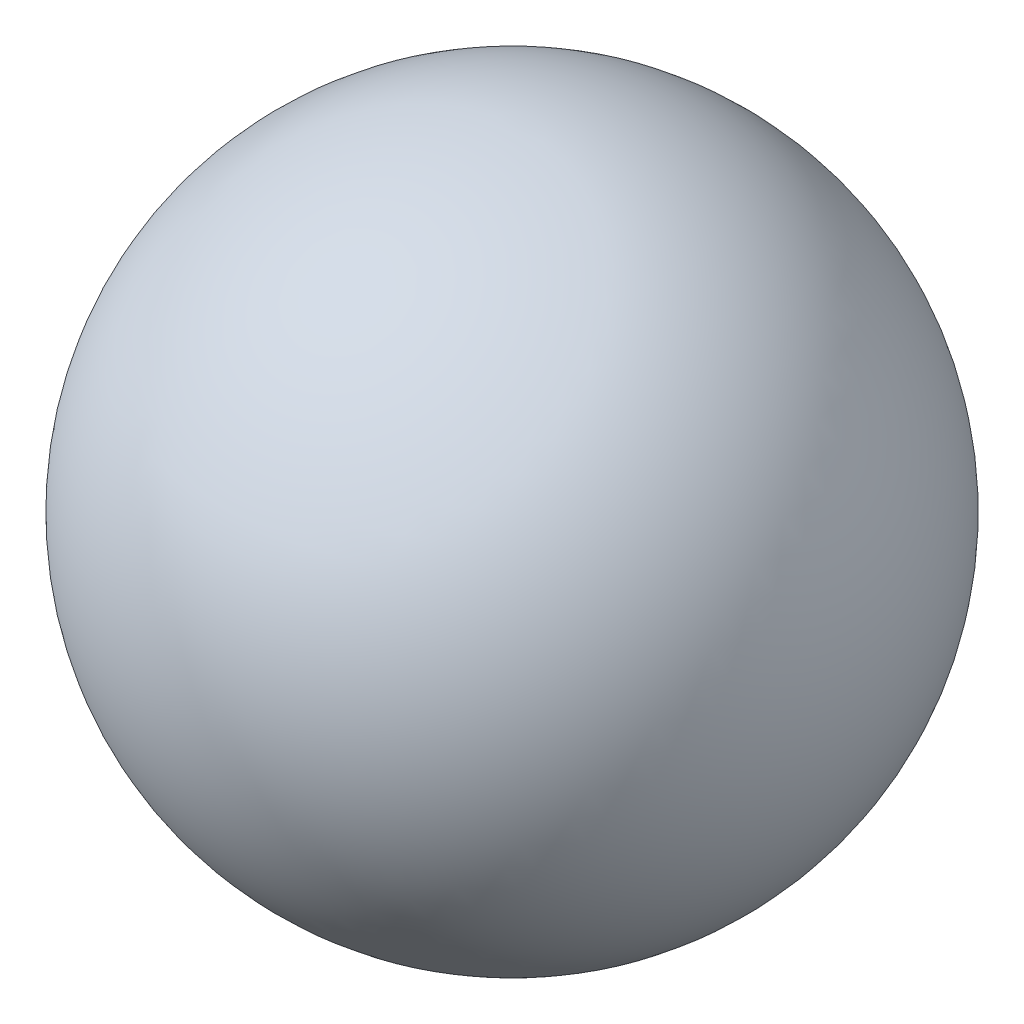
ISO-10303-21;
HEADER;
FILE_DESCRIPTION(('STEP AP214'),'2;1');
FILE_NAME('part.step','',(''),(''),'','','');
FILE_SCHEMA(('AUTOMOTIVE_DESIGN { 1 0 10303 214 1 1 1 1 }'));
ENDSEC;
DATA;
#1=APPLICATION_CONTEXT('core data for automotive mechanical design processes');
#2=APPLICATION_PROTOCOL_DEFINITION('international standard','automotive_design',2000,#1);
#3=PRODUCT_CONTEXT('',#1,'mechanical');
#4=PRODUCT('Part','Part','',(#3));
#5=PRODUCT_RELATED_PRODUCT_CATEGORY('part','',(#4));
#6=PRODUCT_DEFINITION_FORMATION('','',#4);
#7=PRODUCT_DEFINITION_CONTEXT('part definition',#1,'design');
#8=PRODUCT_DEFINITION('design','',#6,#7);
#9=PRODUCT_DEFINITION_SHAPE('','',#8);
#10=(LENGTH_UNIT() NAMED_UNIT(*) SI_UNIT(.MILLI.,.METRE.));
#11=(NAMED_UNIT(*) PLANE_ANGLE_UNIT() SI_UNIT($,.RADIAN.));
#12=(NAMED_UNIT(*) SI_UNIT($,.STERADIAN.) SOLID_ANGLE_UNIT());
#13=UNCERTAINTY_MEASURE_WITH_UNIT(LENGTH_MEASURE(1.E-05),#10,'distance_accuracy_value','');
#14=(GEOMETRIC_REPRESENTATION_CONTEXT(3) GLOBAL_UNCERTAINTY_ASSIGNED_CONTEXT((#13)) GLOBAL_UNIT_ASSIGNED_CONTEXT((#10,
#11,#12)) REPRESENTATION_CONTEXT('',''));
#15=CARTESIAN_POINT('',(0.,0.,0.));
#16=DIRECTION('',(0.,0.,1.));
#17=DIRECTION('',(1.,0.,0.));
#18=AXIS2_PLACEMENT_3D('',#15,#16,#17);
#19=CARTESIAN_POINT('',(0.,0.,0.));
#20=DIRECTION('',(0.,-1.,0.));
#21=DIRECTION('',(0.,0.,-1.));
#22=AXIS2_PLACEMENT_3D('',#19,#20,#21);
#23=SPHERICAL_SURFACE('',#22,12.);
#24=CARTESIAN_POINT('',(0.,-12.,0.));
#25=VERTEX_POINT('',#24);
#26=VERTEX_LOOP('',#25);
#27=FACE_BOUND('',#26,.T.);
#28=ADVANCED_FACE('F35',(#27),#23,.T.);
#29=CLOSED_SHELL('',(#28));
#30=MANIFOLD_SOLID_BREP('B2',#29);
#31=ADVANCED_BREP_SHAPE_REPRESENTATION('',(#18,#30),#14);
#32=SHAPE_DEFINITION_REPRESENTATION(#9,#31);
ENDSEC;
END-ISO-10303-21;
